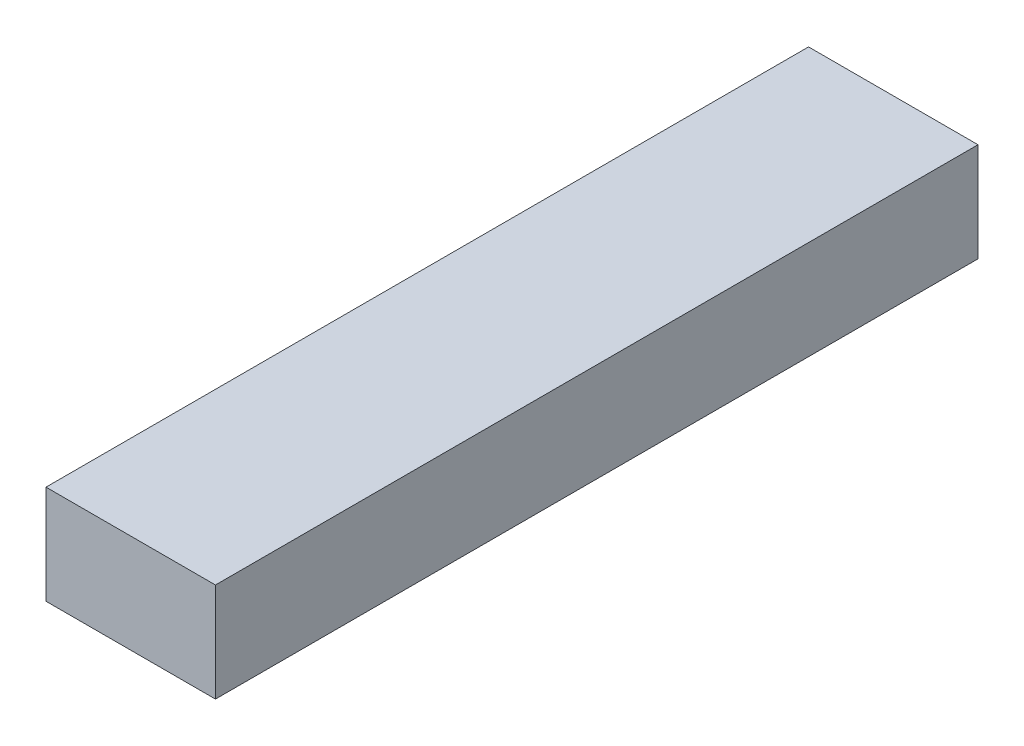
ISO-10303-21;
HEADER;
FILE_DESCRIPTION(('STEP AP214'),'2;1');
FILE_NAME('part.step','',(''),(''),'','','');
FILE_SCHEMA(('AUTOMOTIVE_DESIGN { 1 0 10303 214 1 1 1 1 }'));
ENDSEC;
DATA;
#1=APPLICATION_CONTEXT('core data for automotive mechanical design processes');
#2=APPLICATION_PROTOCOL_DEFINITION('international standard','automotive_design',2000,#1);
#3=PRODUCT_CONTEXT('',#1,'mechanical');
#4=PRODUCT('Part','Part','',(#3));
#5=PRODUCT_RELATED_PRODUCT_CATEGORY('part','',(#4));
#6=PRODUCT_DEFINITION_FORMATION('','',#4);
#7=PRODUCT_DEFINITION_CONTEXT('part definition',#1,'design');
#8=PRODUCT_DEFINITION('design','',#6,#7);
#9=PRODUCT_DEFINITION_SHAPE('','',#8);
#10=(LENGTH_UNIT() NAMED_UNIT(*) SI_UNIT(.MILLI.,.METRE.));
#11=(NAMED_UNIT(*) PLANE_ANGLE_UNIT() SI_UNIT($,.RADIAN.));
#12=(NAMED_UNIT(*) SI_UNIT($,.STERADIAN.) SOLID_ANGLE_UNIT());
#13=UNCERTAINTY_MEASURE_WITH_UNIT(LENGTH_MEASURE(1.E-05),#10,'distance_accuracy_value','');
#14=(GEOMETRIC_REPRESENTATION_CONTEXT(3) GLOBAL_UNCERTAINTY_ASSIGNED_CONTEXT((#13)) GLOBAL_UNIT_ASSIGNED_CONTEXT((#10,
#11,#12)) REPRESENTATION_CONTEXT('',''));
#15=CARTESIAN_POINT('',(0.,0.,0.));
#16=DIRECTION('',(0.,0.,1.));
#17=DIRECTION('',(1.,0.,0.));
#18=AXIS2_PLACEMENT_3D('',#15,#16,#17);
#19=CARTESIAN_POINT('',(-152.4,-88.9,1371.6));
#20=DIRECTION('',(1.,0.,0.));
#21=DIRECTION('',(0.,0.,-1.));
#22=AXIS2_PLACEMENT_3D('',#19,#20,#21);
#23=PLANE('',#22);
#24=DIRECTION('',(0.,-1.,0.));
#25=VECTOR('',#24,1.);
#26=CARTESIAN_POINT('',(-152.4,-88.9,0.));
#27=LINE('',#26,#25);
#28=CARTESIAN_POINT('',(-152.4,88.9,0.));
#29=VERTEX_POINT('',#28);
#30=CARTESIAN_POINT('',(-152.4,-88.9,0.));
#31=VERTEX_POINT('',#30);
#32=EDGE_CURVE('E113',#29,#31,#27,.T.);
#33=ORIENTED_EDGE('',*,*,#32,.T.);
#34=DIRECTION('',(0.,0.,-1.));
#35=VECTOR('',#34,1.);
#36=CARTESIAN_POINT('',(-152.4,-88.9,1371.6));
#37=LINE('',#36,#35);
#38=CARTESIAN_POINT('',(-152.4,-88.9,1371.6));
#39=VERTEX_POINT('',#38);
#40=EDGE_CURVE('E11',#39,#31,#37,.T.);
#41=ORIENTED_EDGE('',*,*,#40,.F.);
#42=DIRECTION('',(0.,-1.,0.));
#43=VECTOR('',#42,1.);
#44=CARTESIAN_POINT('',(-152.4,-88.9,1371.6));
#45=LINE('',#44,#43);
#46=CARTESIAN_POINT('',(-152.4,88.9,1371.6));
#47=VERTEX_POINT('',#46);
#48=EDGE_CURVE('E97',#47,#39,#45,.T.);
#49=ORIENTED_EDGE('',*,*,#48,.F.);
#50=DIRECTION('',(0.,0.,-1.));
#51=VECTOR('',#50,1.);
#52=CARTESIAN_POINT('',(-152.4,88.9,1371.6));
#53=LINE('',#52,#51);
#54=EDGE_CURVE('E109',#47,#29,#53,.T.);
#55=ORIENTED_EDGE('',*,*,#54,.T.);
#56=EDGE_LOOP('',(#33,#41,#49,#55));
#57=FACE_BOUND('',#56,.T.);
#58=ADVANCED_FACE('F45',(#57),#23,.F.);
#59=CARTESIAN_POINT('',(152.4,-88.8999999999999,1371.6));
#60=DIRECTION('',(0.,1.,0.));
#61=DIRECTION('',(-1.,0.,0.));
#62=AXIS2_PLACEMENT_3D('',#59,#60,#61);
#63=PLANE('',#62);
#64=DIRECTION('',(1.,0.,0.));
#65=VECTOR('',#64,1.);
#66=CARTESIAN_POINT('',(152.4,-88.8999999999999,0.));
#67=LINE('',#66,#65);
#68=CARTESIAN_POINT('',(152.4,-88.8999999999999,0.));
#69=VERTEX_POINT('',#68);
#70=EDGE_CURVE('E102',#31,#69,#67,.T.);
#71=ORIENTED_EDGE('',*,*,#70,.T.);
#72=DIRECTION('',(0.,0.,-1.));
#73=VECTOR('',#72,1.);
#74=CARTESIAN_POINT('',(152.4,-88.8999999999999,1371.6));
#75=LINE('',#74,#73);
#76=CARTESIAN_POINT('',(152.4,-88.8999999999999,1371.6));
#77=VERTEX_POINT('',#76);
#78=EDGE_CURVE('E54',#77,#69,#75,.T.);
#79=ORIENTED_EDGE('',*,*,#78,.F.);
#80=DIRECTION('',(1.,0.,0.));
#81=VECTOR('',#80,1.);
#82=CARTESIAN_POINT('',(152.4,-88.8999999999999,1371.6));
#83=LINE('',#82,#81);
#84=EDGE_CURVE('E92',#39,#77,#83,.T.);
#85=ORIENTED_EDGE('',*,*,#84,.F.);
#86=ORIENTED_EDGE('',*,*,#40,.T.);
#87=EDGE_LOOP('',(#71,#79,#85,#86));
#88=FACE_BOUND('',#87,.T.);
#89=ADVANCED_FACE('F101',(#88),#63,.F.);
#90=CARTESIAN_POINT('',(152.4,-88.8999999999999,1371.6));
#91=DIRECTION('',(-1.,0.,0.));
#92=DIRECTION('',(0.,0.,1.));
#93=AXIS2_PLACEMENT_3D('',#90,#91,#92);
#94=PLANE('',#93);
#95=DIRECTION('',(0.,1.,0.));
#96=VECTOR('',#95,1.);
#97=CARTESIAN_POINT('',(152.4,-88.8999999999999,0.));
#98=LINE('',#97,#96);
#99=CARTESIAN_POINT('',(152.4,88.9,0.));
#100=VERTEX_POINT('',#99);
#101=EDGE_CURVE('E79',#69,#100,#98,.T.);
#102=ORIENTED_EDGE('',*,*,#101,.T.);
#103=DIRECTION('',(0.,0.,-1.));
#104=VECTOR('',#103,1.);
#105=CARTESIAN_POINT('',(152.4,88.9,1371.6));
#106=LINE('',#105,#104);
#107=CARTESIAN_POINT('',(152.4,88.9,1371.6));
#108=VERTEX_POINT('',#107);
#109=EDGE_CURVE('E104',#108,#100,#106,.T.);
#110=ORIENTED_EDGE('',*,*,#109,.F.);
#111=DIRECTION('',(0.,1.,0.));
#112=VECTOR('',#111,1.);
#113=CARTESIAN_POINT('',(152.4,-88.8999999999999,1371.6));
#114=LINE('',#113,#112);
#115=EDGE_CURVE('E95',#77,#108,#114,.T.);
#116=ORIENTED_EDGE('',*,*,#115,.F.);
#117=ORIENTED_EDGE('',*,*,#78,.T.);
#118=EDGE_LOOP('',(#102,#110,#116,#117));
#119=FACE_BOUND('',#118,.T.);
#120=ADVANCED_FACE('F105',(#119),#94,.F.);
#121=CARTESIAN_POINT('',(152.4,88.9,1371.6));
#122=DIRECTION('',(0.,-1.,0.));
#123=DIRECTION('',(1.,0.,0.));
#124=AXIS2_PLACEMENT_3D('',#121,#122,#123);
#125=PLANE('',#124);
#126=DIRECTION('',(-1.,0.,0.));
#127=VECTOR('',#126,1.);
#128=CARTESIAN_POINT('',(152.4,88.9,0.));
#129=LINE('',#128,#127);
#130=EDGE_CURVE('E85',#100,#29,#129,.T.);
#131=ORIENTED_EDGE('',*,*,#130,.T.);
#132=ORIENTED_EDGE('',*,*,#54,.F.);
#133=DIRECTION('',(-1.,0.,0.));
#134=VECTOR('',#133,1.);
#135=CARTESIAN_POINT('',(152.4,88.9,1371.6));
#136=LINE('',#135,#134);
#137=EDGE_CURVE('E62',#108,#47,#136,.T.);
#138=ORIENTED_EDGE('',*,*,#137,.F.);
#139=ORIENTED_EDGE('',*,*,#109,.T.);
#140=EDGE_LOOP('',(#131,#132,#138,#139));
#141=FACE_BOUND('',#140,.T.);
#142=ADVANCED_FACE('F126',(#141),#125,.F.);
#143=CARTESIAN_POINT('',(0.,0.,1371.6));
#144=DIRECTION('',(0.,0.,1.));
#145=DIRECTION('',(1.,0.,0.));
#146=AXIS2_PLACEMENT_3D('',#143,#144,#145);
#147=PLANE('',#146);
#148=ORIENTED_EDGE('',*,*,#48,.T.);
#149=ORIENTED_EDGE('',*,*,#84,.T.);
#150=ORIENTED_EDGE('',*,*,#115,.T.);
#151=ORIENTED_EDGE('',*,*,#137,.T.);
#152=EDGE_LOOP('',(#148,#149,#150,#151));
#153=FACE_BOUND('',#152,.T.);
#154=ADVANCED_FACE('F93',(#153),#147,.T.);
#155=CARTESIAN_POINT('',(0.,0.,0.));
#156=DIRECTION('',(0.,0.,1.));
#157=DIRECTION('',(1.,0.,0.));
#158=AXIS2_PLACEMENT_3D('',#155,#156,#157);
#159=PLANE('',#158);
#160=ORIENTED_EDGE('',*,*,#32,.F.);
#161=ORIENTED_EDGE('',*,*,#130,.F.);
#162=ORIENTED_EDGE('',*,*,#101,.F.);
#163=ORIENTED_EDGE('',*,*,#70,.F.);
#164=EDGE_LOOP('',(#160,#161,#162,#163));
#165=FACE_BOUND('',#164,.T.);
#166=ADVANCED_FACE('F129',(#165),#159,.F.);
#167=CLOSED_SHELL('',(#58,#89,#120,#142,#154,#166));
#168=MANIFOLD_SOLID_BREP('B2',#167);
#169=ADVANCED_BREP_SHAPE_REPRESENTATION('',(#18,#168),#14);
#170=SHAPE_DEFINITION_REPRESENTATION(#9,#169);
ENDSEC;
END-ISO-10303-21;
